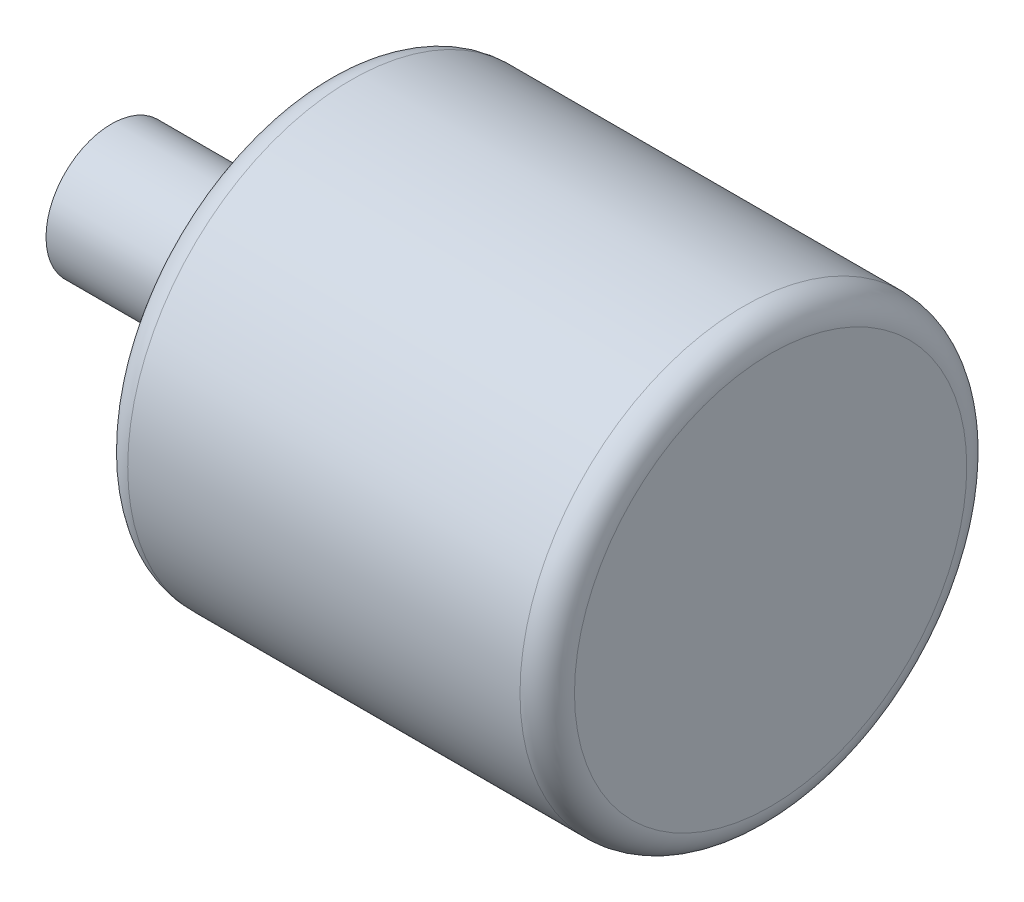
ISO-10303-21;
HEADER;
FILE_DESCRIPTION(('STEP AP214'),'2;1');
FILE_NAME('part.step','',(''),(''),'','','');
FILE_SCHEMA(('AUTOMOTIVE_DESIGN { 1 0 10303 214 1 1 1 1 }'));
ENDSEC;
DATA;
#1=APPLICATION_CONTEXT('core data for automotive mechanical design processes');
#2=APPLICATION_PROTOCOL_DEFINITION('international standard','automotive_design',2000,#1);
#3=PRODUCT_CONTEXT('',#1,'mechanical');
#4=PRODUCT('Part','Part','',(#3));
#5=PRODUCT_RELATED_PRODUCT_CATEGORY('part','',(#4));
#6=PRODUCT_DEFINITION_FORMATION('','',#4);
#7=PRODUCT_DEFINITION_CONTEXT('part definition',#1,'design');
#8=PRODUCT_DEFINITION('design','',#6,#7);
#9=PRODUCT_DEFINITION_SHAPE('','',#8);
#10=(LENGTH_UNIT() NAMED_UNIT(*) SI_UNIT(.MILLI.,.METRE.));
#11=(NAMED_UNIT(*) PLANE_ANGLE_UNIT() SI_UNIT($,.RADIAN.));
#12=(NAMED_UNIT(*) SI_UNIT($,.STERADIAN.) SOLID_ANGLE_UNIT());
#13=UNCERTAINTY_MEASURE_WITH_UNIT(LENGTH_MEASURE(1.E-05),#10,'distance_accuracy_value','');
#14=(GEOMETRIC_REPRESENTATION_CONTEXT(3) GLOBAL_UNCERTAINTY_ASSIGNED_CONTEXT((#13)) GLOBAL_UNIT_ASSIGNED_CONTEXT((#10,
#11,#12)) REPRESENTATION_CONTEXT('',''));
#15=CARTESIAN_POINT('',(0.,0.,0.));
#16=DIRECTION('',(0.,0.,1.));
#17=DIRECTION('',(1.,0.,0.));
#18=AXIS2_PLACEMENT_3D('',#15,#16,#17);
#19=CARTESIAN_POINT('',(-1000.,0.,0.));
#20=DIRECTION('',(-1.,0.,0.));
#21=DIRECTION('',(0.,0.,1.));
#22=AXIS2_PLACEMENT_3D('',#19,#20,#21);
#23=CYLINDRICAL_SURFACE('',#22,59.9999999999998);
#24=CARTESIAN_POINT('',(150.,0.,-2.11251572852918E-13));
#25=DIRECTION('',(1.,0.,0.));
#26=DIRECTION('',(0.,0.,-1.));
#27=AXIS2_PLACEMENT_3D('',#24,#25,#26);
#28=CIRCLE('',#27,59.9999999999998);
#29=CARTESIAN_POINT('',(150.,0.,-60.));
#30=VERTEX_POINT('',#29);
#31=EDGE_CURVE('E69',#30,#30,#28,.F.);
#32=ORIENTED_EDGE('',*,*,#31,.T.);
#33=EDGE_LOOP('',(#32));
#34=FACE_BOUND('',#33,.T.);
#35=CARTESIAN_POINT('',(0.,0.,-1.83697019872103E-13));
#36=DIRECTION('',(-1.,0.,0.));
#37=DIRECTION('',(0.,0.,1.));
#38=AXIS2_PLACEMENT_3D('',#35,#36,#37);
#39=CIRCLE('',#38,59.9999999999998);
#40=CARTESIAN_POINT('',(0.,0.,59.9999999999996));
#41=VERTEX_POINT('',#40);
#42=EDGE_CURVE('E73',#41,#41,#39,.T.);
#43=ORIENTED_EDGE('',*,*,#42,.F.);
#44=EDGE_LOOP('',(#43));
#45=FACE_BOUND('',#44,.T.);
#46=ADVANCED_FACE('F41',(#34,#45),#23,.T.);
#47=CARTESIAN_POINT('',(0.,0.,0.));
#48=DIRECTION('',(1.,0.,0.));
#49=DIRECTION('',(0.,0.,-1.));
#50=AXIS2_PLACEMENT_3D('',#47,#48,#49);
#51=PLANE('',#50);
#52=CARTESIAN_POINT('',(0.,0.,-1.83697019872103E-13));
#53=DIRECTION('',(1.,0.,0.));
#54=DIRECTION('',(0.,0.,-1.));
#55=AXIS2_PLACEMENT_3D('',#52,#53,#54);
#56=CIRCLE('',#55,54.9999999999998);
#57=CARTESIAN_POINT('',(0.,0.,-55.));
#58=VERTEX_POINT('',#57);
#59=EDGE_CURVE('E78',#58,#58,#56,.F.);
#60=ORIENTED_EDGE('',*,*,#59,.F.);
#61=EDGE_LOOP('',(#60));
#62=FACE_BOUND('',#61,.T.);
#63=ORIENTED_EDGE('',*,*,#42,.T.);
#64=EDGE_LOOP('',(#63));
#65=FACE_BOUND('',#64,.T.);
#66=ADVANCED_FACE('F115',(#62,#65),#51,.F.);
#67=CARTESIAN_POINT('',(605.,0.,0.));
#68=DIRECTION('',(-1.,0.,0.));
#69=DIRECTION('',(0.,0.,1.));
#70=AXIS2_PLACEMENT_3D('',#67,#68,#69);
#71=PLANE('',#70);
#72=CARTESIAN_POINT('',(605.,0.,-2.94833716894725E-13));
#73=DIRECTION('',(-1.,0.,0.));
#74=DIRECTION('',(0.,0.,1.));
#75=AXIS2_PLACEMENT_3D('',#72,#73,#74);
#76=CIRCLE('',#75,180.);
#77=CARTESIAN_POINT('',(605.,0.,180.));
#78=VERTEX_POINT('',#77);
#79=EDGE_CURVE('E49',#78,#78,#76,.F.);
#80=ORIENTED_EDGE('',*,*,#79,.T.);
#81=EDGE_LOOP('',(#80));
#82=FACE_BOUND('',#81,.T.);
#83=ADVANCED_FACE('F118',(#82),#71,.F.);
#84=CARTESIAN_POINT('',(-1000.,0.,0.));
#85=DIRECTION('',(-1.,0.,0.));
#86=DIRECTION('',(0.,0.,1.));
#87=AXIS2_PLACEMENT_3D('',#84,#85,#86);
#88=CYLINDRICAL_SURFACE('',#87,205.);
#89=CARTESIAN_POINT('',(580.,0.,-2.90241291397923E-13));
#90=DIRECTION('',(-1.,0.,0.));
#91=DIRECTION('',(0.,0.,1.));
#92=AXIS2_PLACEMENT_3D('',#89,#90,#91);
#93=CIRCLE('',#92,205.);
#94=CARTESIAN_POINT('',(580.,0.,205.));
#95=VERTEX_POINT('',#94);
#96=EDGE_CURVE('E54',#95,#95,#93,.T.);
#97=ORIENTED_EDGE('',*,*,#96,.T.);
#98=EDGE_LOOP('',(#97));
#99=FACE_BOUND('',#98,.T.);
#100=CARTESIAN_POINT('',(220.,0.,-2.24110364243966E-13));
#101=DIRECTION('',(1.,0.,0.));
#102=DIRECTION('',(0.,0.,-1.));
#103=AXIS2_PLACEMENT_3D('',#100,#101,#102);
#104=CIRCLE('',#103,205.);
#105=CARTESIAN_POINT('',(220.,0.,-205.));
#106=VERTEX_POINT('',#105);
#107=EDGE_CURVE('E59',#106,#106,#104,.T.);
#108=ORIENTED_EDGE('',*,*,#107,.T.);
#109=EDGE_LOOP('',(#108));
#110=FACE_BOUND('',#109,.T.);
#111=ADVANCED_FACE('F143',(#99,#110),#88,.T.);
#112=CARTESIAN_POINT('',(195.,0.,0.));
#113=DIRECTION('',(1.,0.,0.));
#114=DIRECTION('',(0.,0.,-1.));
#115=AXIS2_PLACEMENT_3D('',#112,#113,#114);
#116=PLANE('',#115);
#117=CARTESIAN_POINT('',(195.,0.,-2.19517938747163E-13));
#118=DIRECTION('',(1.,0.,0.));
#119=DIRECTION('',(0.,0.,-1.));
#120=AXIS2_PLACEMENT_3D('',#117,#118,#119);
#121=CIRCLE('',#120,180.);
#122=CARTESIAN_POINT('',(195.,0.,-180.));
#123=VERTEX_POINT('',#122);
#124=EDGE_CURVE('E10',#123,#123,#121,.F.);
#125=ORIENTED_EDGE('',*,*,#124,.T.);
#126=EDGE_LOOP('',(#125));
#127=FACE_BOUND('',#126,.T.);
#128=CARTESIAN_POINT('',(195.,0.,-2.19517938747163E-13));
#129=DIRECTION('',(1.,0.,0.));
#130=DIRECTION('',(0.,0.,-1.));
#131=AXIS2_PLACEMENT_3D('',#128,#129,#130);
#132=CIRCLE('',#131,105.);
#133=CARTESIAN_POINT('',(195.,0.,-105.));
#134=VERTEX_POINT('',#133);
#135=EDGE_CURVE('E65',#134,#134,#132,.T.);
#136=ORIENTED_EDGE('',*,*,#135,.T.);
#137=EDGE_LOOP('',(#136));
#138=FACE_BOUND('',#137,.T.);
#139=ADVANCED_FACE('F132',(#127,#138),#116,.F.);
#140=CARTESIAN_POINT('',(150.,0.,-2.11251572852918E-13));
#141=DIRECTION('',(1.,0.,0.));
#142=DIRECTION('',(0.,0.,-1.));
#143=AXIS2_PLACEMENT_3D('',#140,#141,#142);
#144=TOROIDAL_SURFACE('',#143,105.,45.);
#145=ORIENTED_EDGE('',*,*,#135,.F.);
#146=EDGE_LOOP('',(#145));
#147=FACE_BOUND('',#146,.T.);
#148=ORIENTED_EDGE('',*,*,#31,.F.);
#149=EDGE_LOOP('',(#148));
#150=FACE_BOUND('',#149,.T.);
#151=ADVANCED_FACE('F129',(#147,#150),#144,.F.);
#152=CARTESIAN_POINT('',(580.,0.,-2.90241291397923E-13));
#153=DIRECTION('',(-1.,0.,0.));
#154=DIRECTION('',(0.,0.,1.));
#155=AXIS2_PLACEMENT_3D('',#152,#153,#154);
#156=TOROIDAL_SURFACE('',#155,180.,25.);
#157=ORIENTED_EDGE('',*,*,#79,.F.);
#158=EDGE_LOOP('',(#157));
#159=FACE_BOUND('',#158,.T.);
#160=ORIENTED_EDGE('',*,*,#96,.F.);
#161=EDGE_LOOP('',(#160));
#162=FACE_BOUND('',#161,.T.);
#163=ADVANCED_FACE('F131',(#159,#162),#156,.T.);
#164=CARTESIAN_POINT('',(220.,0.,-2.24110364243966E-13));
#165=DIRECTION('',(1.,0.,0.));
#166=DIRECTION('',(0.,0.,-1.));
#167=AXIS2_PLACEMENT_3D('',#164,#165,#166);
#168=TOROIDAL_SURFACE('',#167,180.,25.);
#169=ORIENTED_EDGE('',*,*,#107,.F.);
#170=EDGE_LOOP('',(#169));
#171=FACE_BOUND('',#170,.T.);
#172=ORIENTED_EDGE('',*,*,#124,.F.);
#173=EDGE_LOOP('',(#172));
#174=FACE_BOUND('',#173,.T.);
#175=ADVANCED_FACE('F43',(#171,#174),#168,.T.);
#176=CARTESIAN_POINT('',(-1000.,0.,0.));
#177=DIRECTION('',(-1.,0.,0.));
#178=DIRECTION('',(0.,0.,1.));
#179=AXIS2_PLACEMENT_3D('',#176,#177,#178);
#180=CYLINDRICAL_SURFACE('',#179,54.9999999999998);
#181=CARTESIAN_POINT('',(150.,0.,-2.11251572852918E-13));
#182=DIRECTION('',(-1.,0.,0.));
#183=DIRECTION('',(0.,0.,1.));
#184=AXIS2_PLACEMENT_3D('',#181,#182,#183);
#185=CIRCLE('',#184,54.9999999999998);
#186=CARTESIAN_POINT('',(150.,0.,54.9999999999996));
#187=VERTEX_POINT('',#186);
#188=EDGE_CURVE('E82',#187,#187,#185,.T.);
#189=ORIENTED_EDGE('',*,*,#188,.F.);
#190=EDGE_LOOP('',(#189));
#191=FACE_BOUND('',#190,.T.);
#192=ORIENTED_EDGE('',*,*,#59,.T.);
#193=EDGE_LOOP('',(#192));
#194=FACE_BOUND('',#193,.T.);
#195=ADVANCED_FACE('F108',(#191,#194),#180,.F.);
#196=CARTESIAN_POINT('',(595.,0.,0.));
#197=DIRECTION('',(-1.,0.,0.));
#198=DIRECTION('',(0.,0.,1.));
#199=AXIS2_PLACEMENT_3D('',#196,#197,#198);
#200=PLANE('',#199);
#201=CARTESIAN_POINT('',(595.,0.,-2.92996746696004E-13));
#202=DIRECTION('',(-1.,0.,0.));
#203=DIRECTION('',(0.,0.,1.));
#204=AXIS2_PLACEMENT_3D('',#201,#202,#203);
#205=CIRCLE('',#204,193.228756555323);
#206=CARTESIAN_POINT('',(595.,0.,193.228756555323));
#207=VERTEX_POINT('',#206);
#208=EDGE_CURVE('E83',#207,#207,#205,.F.);
#209=ORIENTED_EDGE('',*,*,#208,.F.);
#210=EDGE_LOOP('',(#209));
#211=FACE_BOUND('',#210,.T.);
#212=ADVANCED_FACE('F111',(#211),#200,.T.);
#213=CARTESIAN_POINT('',(-1000.,0.,0.));
#214=DIRECTION('',(-1.,0.,0.));
#215=DIRECTION('',(0.,0.,1.));
#216=AXIS2_PLACEMENT_3D('',#213,#214,#215);
#217=CYLINDRICAL_SURFACE('',#216,200.);
#218=CARTESIAN_POINT('',(580.,0.,-2.90241291397923E-13));
#219=DIRECTION('',(-1.,0.,0.));
#220=DIRECTION('',(0.,0.,1.));
#221=AXIS2_PLACEMENT_3D('',#218,#219,#220);
#222=CIRCLE('',#221,200.);
#223=CARTESIAN_POINT('',(580.,0.,200.));
#224=VERTEX_POINT('',#223);
#225=EDGE_CURVE('E87',#224,#224,#222,.T.);
#226=ORIENTED_EDGE('',*,*,#225,.F.);
#227=EDGE_LOOP('',(#226));
#228=FACE_BOUND('',#227,.T.);
#229=CARTESIAN_POINT('',(220.,0.,-2.24110364243966E-13));
#230=DIRECTION('',(-1.,0.,0.));
#231=DIRECTION('',(0.,0.,1.));
#232=AXIS2_PLACEMENT_3D('',#229,#230,#231);
#233=CIRCLE('',#232,200.);
#234=CARTESIAN_POINT('',(220.,0.,200.));
#235=VERTEX_POINT('',#234);
#236=EDGE_CURVE('E91',#235,#235,#233,.F.);
#237=ORIENTED_EDGE('',*,*,#236,.F.);
#238=EDGE_LOOP('',(#237));
#239=FACE_BOUND('',#238,.T.);
#240=ADVANCED_FACE('F169',(#228,#239),#217,.F.);
#241=CARTESIAN_POINT('',(200.,0.,0.));
#242=DIRECTION('',(1.,0.,0.));
#243=DIRECTION('',(0.,0.,-1.));
#244=AXIS2_PLACEMENT_3D('',#241,#242,#243);
#245=PLANE('',#244);
#246=CARTESIAN_POINT('',(200.,0.,-2.20436423846524E-13));
#247=DIRECTION('',(1.,0.,0.));
#248=DIRECTION('',(0.,0.,-1.));
#249=AXIS2_PLACEMENT_3D('',#246,#247,#248);
#250=CIRCLE('',#249,180.);
#251=CARTESIAN_POINT('',(200.,0.,-180.));
#252=VERTEX_POINT('',#251);
#253=EDGE_CURVE('E77',#252,#252,#250,.F.);
#254=ORIENTED_EDGE('',*,*,#253,.F.);
#255=EDGE_LOOP('',(#254));
#256=FACE_BOUND('',#255,.T.);
#257=CARTESIAN_POINT('',(200.,0.,-2.20436423846524E-13));
#258=DIRECTION('',(1.,0.,0.));
#259=DIRECTION('',(0.,0.,-1.));
#260=AXIS2_PLACEMENT_3D('',#257,#258,#259);
#261=CIRCLE('',#260,105.);
#262=CARTESIAN_POINT('',(200.,0.,-105.));
#263=VERTEX_POINT('',#262);
#264=EDGE_CURVE('E95',#263,#263,#261,.T.);
#265=ORIENTED_EDGE('',*,*,#264,.F.);
#266=EDGE_LOOP('',(#265));
#267=FACE_BOUND('',#266,.T.);
#268=ADVANCED_FACE('F165',(#256,#267),#245,.T.);
#269=CARTESIAN_POINT('',(150.,0.,-2.11251572852918E-13));
#270=DIRECTION('',(1.,0.,0.));
#271=DIRECTION('',(0.,0.,-1.));
#272=AXIS2_PLACEMENT_3D('',#269,#270,#271);
#273=TOROIDAL_SURFACE('',#272,105.,50.);
#274=ORIENTED_EDGE('',*,*,#264,.T.);
#275=EDGE_LOOP('',(#274));
#276=FACE_BOUND('',#275,.T.);
#277=ORIENTED_EDGE('',*,*,#188,.T.);
#278=EDGE_LOOP('',(#277));
#279=FACE_BOUND('',#278,.T.);
#280=ADVANCED_FACE('F106',(#276,#279),#273,.T.);
#281=CARTESIAN_POINT('',(580.,0.,-2.90241291397923E-13));
#282=DIRECTION('',(-1.,0.,0.));
#283=DIRECTION('',(0.,0.,1.));
#284=AXIS2_PLACEMENT_3D('',#281,#282,#283);
#285=TOROIDAL_SURFACE('',#284,180.,20.);
#286=ORIENTED_EDGE('',*,*,#208,.T.);
#287=EDGE_LOOP('',(#286));
#288=FACE_BOUND('',#287,.T.);
#289=ORIENTED_EDGE('',*,*,#225,.T.);
#290=EDGE_LOOP('',(#289));
#291=FACE_BOUND('',#290,.T.);
#292=ADVANCED_FACE('F158',(#288,#291),#285,.F.);
#293=CARTESIAN_POINT('',(220.,0.,-2.24110364243966E-13));
#294=DIRECTION('',(1.,0.,0.));
#295=DIRECTION('',(0.,0.,-1.));
#296=AXIS2_PLACEMENT_3D('',#293,#294,#295);
#297=TOROIDAL_SURFACE('',#296,180.,20.);
#298=ORIENTED_EDGE('',*,*,#236,.T.);
#299=EDGE_LOOP('',(#298));
#300=FACE_BOUND('',#299,.T.);
#301=ORIENTED_EDGE('',*,*,#253,.T.);
#302=EDGE_LOOP('',(#301));
#303=FACE_BOUND('',#302,.T.);
#304=ADVANCED_FACE('F155',(#300,#303),#297,.F.);
#305=CLOSED_SHELL('',(#46,#66,#83,#111,#139,#151,#163,#175,#195,#212,#240,#268,#280,#292,#304));
#306=MANIFOLD_SOLID_BREP('B2',#305);
#307=ADVANCED_BREP_SHAPE_REPRESENTATION('',(#18,#306),#14);
#308=SHAPE_DEFINITION_REPRESENTATION(#9,#307);
ENDSEC;
END-ISO-10303-21;
